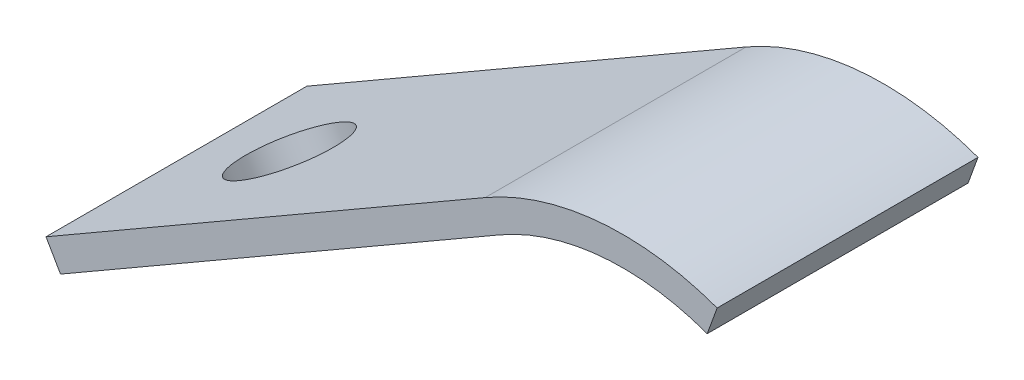
ISO-10303-21;
HEADER;
FILE_DESCRIPTION(('STEP AP214'),'2;1');
FILE_NAME('part.step','',(''),(''),'','','');
FILE_SCHEMA(('AUTOMOTIVE_DESIGN { 1 0 10303 214 1 1 1 1 }'));
ENDSEC;
DATA;
#1=APPLICATION_CONTEXT('core data for automotive mechanical design processes');
#2=APPLICATION_PROTOCOL_DEFINITION('international standard','automotive_design',2000,#1);
#3=PRODUCT_CONTEXT('',#1,'mechanical');
#4=PRODUCT('Part','Part','',(#3));
#5=PRODUCT_RELATED_PRODUCT_CATEGORY('part','',(#4));
#6=PRODUCT_DEFINITION_FORMATION('','',#4);
#7=PRODUCT_DEFINITION_CONTEXT('part definition',#1,'design');
#8=PRODUCT_DEFINITION('design','',#6,#7);
#9=PRODUCT_DEFINITION_SHAPE('','',#8);
#10=(LENGTH_UNIT() NAMED_UNIT(*) SI_UNIT(.MILLI.,.METRE.));
#11=(NAMED_UNIT(*) PLANE_ANGLE_UNIT() SI_UNIT($,.RADIAN.));
#12=(NAMED_UNIT(*) SI_UNIT($,.STERADIAN.) SOLID_ANGLE_UNIT());
#13=UNCERTAINTY_MEASURE_WITH_UNIT(LENGTH_MEASURE(1.E-05),#10,'distance_accuracy_value','');
#14=(GEOMETRIC_REPRESENTATION_CONTEXT(3) GLOBAL_UNCERTAINTY_ASSIGNED_CONTEXT((#13)) GLOBAL_UNIT_ASSIGNED_CONTEXT((#10,
#11,#12)) REPRESENTATION_CONTEXT('',''));
#15=CARTESIAN_POINT('',(0.,0.,0.));
#16=DIRECTION('',(0.,0.,1.));
#17=DIRECTION('',(1.,0.,0.));
#18=AXIS2_PLACEMENT_3D('',#15,#16,#17);
#19=CARTESIAN_POINT('',(-39.8108891324554,-1.04551732809558,9.));
#20=DIRECTION('',(0.86602540378444,0.499999999999998,0.));
#21=DIRECTION('',(-0.499999999999998,0.86602540378444,0.));
#22=AXIS2_PLACEMENT_3D('',#19,#20,#21);
#23=PLANE('',#22);
#24=DIRECTION('',(0.499999999999998,-0.86602540378444,0.));
#25=VECTOR('',#24,1.);
#26=CARTESIAN_POINT('',(-39.8108891324554,-1.04551732809558,-9.));
#27=LINE('',#26,#25);
#28=CARTESIAN_POINT('',(-39.8108891324554,-1.04551732809558,-9.));
#29=VERTEX_POINT('',#28);
#30=CARTESIAN_POINT('',(-38.8108891324554,-2.77756813566445,-9.));
#31=VERTEX_POINT('',#30);
#32=EDGE_CURVE('E119',#29,#31,#27,.T.);
#33=ORIENTED_EDGE('',*,*,#32,.T.);
#34=DIRECTION('',(0.,0.,-1.));
#35=VECTOR('',#34,1.);
#36=CARTESIAN_POINT('',(-38.8108891324554,-2.77756813566445,9.));
#37=LINE('',#36,#35);
#38=CARTESIAN_POINT('',(-38.8108891324554,-2.77756813566445,9.));
#39=VERTEX_POINT('',#38);
#40=EDGE_CURVE('E11',#39,#31,#37,.T.);
#41=ORIENTED_EDGE('',*,*,#40,.F.);
#42=DIRECTION('',(0.499999999999998,-0.86602540378444,0.));
#43=VECTOR('',#42,1.);
#44=CARTESIAN_POINT('',(-39.8108891324554,-1.04551732809558,9.));
#45=LINE('',#44,#43);
#46=CARTESIAN_POINT('',(-39.8108891324554,-1.04551732809558,9.));
#47=VERTEX_POINT('',#46);
#48=EDGE_CURVE('E130',#47,#39,#45,.T.);
#49=ORIENTED_EDGE('',*,*,#48,.F.);
#50=DIRECTION('',(0.,0.,-1.));
#51=VECTOR('',#50,1.);
#52=CARTESIAN_POINT('',(-39.8108891324554,-1.04551732809558,9.));
#53=LINE('',#52,#51);
#54=EDGE_CURVE('E115',#47,#29,#53,.T.);
#55=ORIENTED_EDGE('',*,*,#54,.T.);
#56=EDGE_LOOP('',(#33,#41,#49,#55));
#57=FACE_BOUND('',#56,.T.);
#58=ADVANCED_FACE('F35',(#57),#23,.F.);
#59=CARTESIAN_POINT('',(-38.8108891324554,-2.77756813566445,9.));
#60=DIRECTION('',(-0.499999999999998,0.86602540378444,0.));
#61=DIRECTION('',(-0.86602540378444,-0.499999999999998,0.));
#62=AXIS2_PLACEMENT_3D('',#59,#60,#61);
#63=PLANE('',#62);
#64=CARTESIAN_POINT('',(-31.0166604983954,1.72243186433553,0.));
#65=DIRECTION('',(-0.499999999999998,0.86602540378444,0.));
#66=DIRECTION('',(-0.86602540378444,-0.499999999999998,0.));
#67=AXIS2_PLACEMENT_3D('',#64,#65,#66);
#68=CIRCLE('',#67,3.5);
#69=CARTESIAN_POINT('',(-34.0477494116409,-0.027568135664461,0.));
#70=VERTEX_POINT('',#69);
#71=EDGE_CURVE('E123',#70,#70,#68,.T.);
#72=ORIENTED_EDGE('',*,*,#71,.T.);
#73=EDGE_LOOP('',(#72));
#74=FACE_BOUND('',#73,.T.);
#75=DIRECTION('',(0.86602540378444,0.499999999999998,0.));
#76=VECTOR('',#75,1.);
#77=CARTESIAN_POINT('',(-38.8108891324554,-2.77756813566445,-9.));
#78=LINE('',#77,#76);
#79=CARTESIAN_POINT('',(-8.49999999999996,14.7224318643355,-9.));
#80=VERTEX_POINT('',#79);
#81=EDGE_CURVE('E122',#31,#80,#78,.T.);
#82=ORIENTED_EDGE('',*,*,#81,.T.);
#83=DIRECTION('',(0.,0.,-1.));
#84=VECTOR('',#83,1.);
#85=CARTESIAN_POINT('',(-8.49999999999996,14.7224318643355,9.));
#86=LINE('',#85,#84);
#87=CARTESIAN_POINT('',(-8.49999999999996,14.7224318643355,9.));
#88=VERTEX_POINT('',#87);
#89=EDGE_CURVE('E43',#88,#80,#86,.T.);
#90=ORIENTED_EDGE('',*,*,#89,.F.);
#91=DIRECTION('',(0.86602540378444,0.499999999999998,0.));
#92=VECTOR('',#91,1.);
#93=CARTESIAN_POINT('',(-38.8108891324554,-2.77756813566445,9.));
#94=LINE('',#93,#92);
#95=EDGE_CURVE('E88',#39,#88,#94,.T.);
#96=ORIENTED_EDGE('',*,*,#95,.F.);
#97=ORIENTED_EDGE('',*,*,#40,.T.);
#98=EDGE_LOOP('',(#82,#90,#96,#97));
#99=FACE_BOUND('',#98,.T.);
#100=ADVANCED_FACE('F156',(#74,#99),#63,.F.);
#101=CARTESIAN_POINT('',(0.,0.,9.));
#102=DIRECTION('',(0.,0.,-1.));
#103=DIRECTION('',(-1.,0.,0.));
#104=AXIS2_PLACEMENT_3D('',#101,#102,#103);
#105=CYLINDRICAL_SURFACE('',#104,17.);
#106=CARTESIAN_POINT('',(0.,0.,-9.));
#107=DIRECTION('',(0.,0.,-1.));
#108=DIRECTION('',(1.,0.,0.));
#109=AXIS2_PLACEMENT_3D('',#106,#107,#108);
#110=CIRCLE('',#109,17.);
#111=CARTESIAN_POINT('',(5.81434243653638,15.9747745533604,-9.));
#112=VERTEX_POINT('',#111);
#113=EDGE_CURVE('E125',#80,#112,#110,.T.);
#114=ORIENTED_EDGE('',*,*,#113,.T.);
#115=DIRECTION('',(0.,0.,-1.));
#116=VECTOR('',#115,1.);
#117=CARTESIAN_POINT('',(5.81434243653638,15.9747745533604,9.));
#118=LINE('',#117,#116);
#119=CARTESIAN_POINT('',(5.81434243653638,15.9747745533604,9.));
#120=VERTEX_POINT('',#119);
#121=EDGE_CURVE('E110',#120,#112,#118,.T.);
#122=ORIENTED_EDGE('',*,*,#121,.F.);
#123=CARTESIAN_POINT('',(0.,0.,9.));
#124=DIRECTION('',(0.,0.,-1.));
#125=DIRECTION('',(1.,0.,0.));
#126=AXIS2_PLACEMENT_3D('',#123,#124,#125);
#127=CIRCLE('',#126,17.);
#128=EDGE_CURVE('E101',#88,#120,#127,.T.);
#129=ORIENTED_EDGE('',*,*,#128,.F.);
#130=ORIENTED_EDGE('',*,*,#89,.T.);
#131=EDGE_LOOP('',(#114,#122,#129,#130));
#132=FACE_BOUND('',#131,.T.);
#133=ADVANCED_FACE('F136',(#132),#105,.F.);
#134=CARTESIAN_POINT('',(6.49838272318772,17.8541597949323,9.));
#135=DIRECTION('',(-0.939692620785908,0.342020143325669,0.));
#136=DIRECTION('',(-0.342020143325669,-0.939692620785908,0.));
#137=AXIS2_PLACEMENT_3D('',#134,#135,#136);
#138=PLANE('',#137);
#139=DIRECTION('',(0.342020143325669,0.939692620785908,0.));
#140=VECTOR('',#139,1.);
#141=CARTESIAN_POINT('',(6.49838272318772,17.8541597949323,-9.));
#142=LINE('',#141,#140);
#143=CARTESIAN_POINT('',(6.49838272318772,17.8541597949323,-9.));
#144=VERTEX_POINT('',#143);
#145=EDGE_CURVE('E109',#112,#144,#142,.T.);
#146=ORIENTED_EDGE('',*,*,#145,.T.);
#147=DIRECTION('',(0.,0.,-1.));
#148=VECTOR('',#147,1.);
#149=CARTESIAN_POINT('',(6.49838272318772,17.8541597949323,9.));
#150=LINE('',#149,#148);
#151=CARTESIAN_POINT('',(6.49838272318772,17.8541597949323,9.));
#152=VERTEX_POINT('',#151);
#153=EDGE_CURVE('E106',#152,#144,#150,.T.);
#154=ORIENTED_EDGE('',*,*,#153,.F.);
#155=DIRECTION('',(0.342020143325669,0.939692620785908,0.));
#156=VECTOR('',#155,1.);
#157=CARTESIAN_POINT('',(6.49838272318772,17.8541597949323,9.));
#158=LINE('',#157,#156);
#159=EDGE_CURVE('E95',#120,#152,#158,.T.);
#160=ORIENTED_EDGE('',*,*,#159,.F.);
#161=ORIENTED_EDGE('',*,*,#121,.T.);
#162=EDGE_LOOP('',(#146,#154,#160,#161));
#163=FACE_BOUND('',#162,.T.);
#164=ADVANCED_FACE('F107',(#163),#138,.F.);
#165=CARTESIAN_POINT('',(0.,0.,9.));
#166=DIRECTION('',(0.,0.,-1.));
#167=DIRECTION('',(-1.,0.,0.));
#168=AXIS2_PLACEMENT_3D('',#165,#166,#167);
#169=CYLINDRICAL_SURFACE('',#168,19.);
#170=CARTESIAN_POINT('',(0.,0.,-9.));
#171=DIRECTION('',(0.,0.,1.));
#172=DIRECTION('',(1.,0.,0.));
#173=AXIS2_PLACEMENT_3D('',#170,#171,#172);
#174=CIRCLE('',#173,19.);
#175=CARTESIAN_POINT('',(-9.49999999999995,16.4544826719044,-9.));
#176=VERTEX_POINT('',#175);
#177=EDGE_CURVE('E74',#144,#176,#174,.T.);
#178=ORIENTED_EDGE('',*,*,#177,.T.);
#179=DIRECTION('',(0.,0.,-1.));
#180=VECTOR('',#179,1.);
#181=CARTESIAN_POINT('',(-9.49999999999995,16.4544826719044,9.));
#182=LINE('',#181,#180);
#183=CARTESIAN_POINT('',(-9.49999999999995,16.4544826719044,9.));
#184=VERTEX_POINT('',#183);
#185=EDGE_CURVE('E111',#184,#176,#182,.T.);
#186=ORIENTED_EDGE('',*,*,#185,.F.);
#187=CARTESIAN_POINT('',(0.,0.,9.));
#188=DIRECTION('',(0.,0.,1.));
#189=DIRECTION('',(1.,0.,0.));
#190=AXIS2_PLACEMENT_3D('',#187,#188,#189);
#191=CIRCLE('',#190,19.);
#192=EDGE_CURVE('E99',#152,#184,#191,.T.);
#193=ORIENTED_EDGE('',*,*,#192,.F.);
#194=ORIENTED_EDGE('',*,*,#153,.T.);
#195=EDGE_LOOP('',(#178,#186,#193,#194));
#196=FACE_BOUND('',#195,.T.);
#197=ADVANCED_FACE('F113',(#196),#169,.T.);
#198=CARTESIAN_POINT('',(-39.8108891324554,-1.04551732809558,9.));
#199=DIRECTION('',(0.499999999999998,-0.86602540378444,0.));
#200=DIRECTION('',(0.86602540378444,0.499999999999998,0.));
#201=AXIS2_PLACEMENT_3D('',#198,#199,#200);
#202=PLANE('',#201);
#203=CARTESIAN_POINT('',(-32.0166604983954,3.45448267190441,0.));
#204=DIRECTION('',(-0.499999999999998,0.86602540378444,0.));
#205=DIRECTION('',(-0.86602540378444,-0.499999999999998,0.));
#206=AXIS2_PLACEMENT_3D('',#203,#204,#205);
#207=CIRCLE('',#206,3.5);
#208=CARTESIAN_POINT('',(-35.0477494116409,1.70448267190442,0.));
#209=VERTEX_POINT('',#208);
#210=EDGE_CURVE('E215',#209,#209,#207,.T.);
#211=ORIENTED_EDGE('',*,*,#210,.F.);
#212=EDGE_LOOP('',(#211));
#213=FACE_BOUND('',#212,.T.);
#214=DIRECTION('',(-0.86602540378444,-0.499999999999998,0.));
#215=VECTOR('',#214,1.);
#216=CARTESIAN_POINT('',(-39.8108891324554,-1.04551732809558,-9.));
#217=LINE('',#216,#215);
#218=EDGE_CURVE('E80',#176,#29,#217,.T.);
#219=ORIENTED_EDGE('',*,*,#218,.T.);
#220=ORIENTED_EDGE('',*,*,#54,.F.);
#221=DIRECTION('',(-0.86602540378444,-0.499999999999998,0.));
#222=VECTOR('',#221,1.);
#223=CARTESIAN_POINT('',(-39.8108891324554,-1.04551732809558,9.));
#224=LINE('',#223,#222);
#225=EDGE_CURVE('E51',#184,#47,#224,.T.);
#226=ORIENTED_EDGE('',*,*,#225,.F.);
#227=ORIENTED_EDGE('',*,*,#185,.T.);
#228=EDGE_LOOP('',(#219,#220,#226,#227));
#229=FACE_BOUND('',#228,.T.);
#230=ADVANCED_FACE('F143',(#213,#229),#202,.F.);
#231=CARTESIAN_POINT('',(0.,0.,9.));
#232=DIRECTION('',(0.,0.,1.));
#233=DIRECTION('',(1.,0.,0.));
#234=AXIS2_PLACEMENT_3D('',#231,#232,#233);
#235=PLANE('',#234);
#236=ORIENTED_EDGE('',*,*,#48,.T.);
#237=ORIENTED_EDGE('',*,*,#95,.T.);
#238=ORIENTED_EDGE('',*,*,#128,.T.);
#239=ORIENTED_EDGE('',*,*,#159,.T.);
#240=ORIENTED_EDGE('',*,*,#192,.T.);
#241=ORIENTED_EDGE('',*,*,#225,.T.);
#242=EDGE_LOOP('',(#236,#237,#238,#239,#240,#241));
#243=FACE_BOUND('',#242,.T.);
#244=ADVANCED_FACE('F97',(#243),#235,.T.);
#245=CARTESIAN_POINT('',(0.,0.,-9.));
#246=DIRECTION('',(0.,0.,1.));
#247=DIRECTION('',(1.,0.,0.));
#248=AXIS2_PLACEMENT_3D('',#245,#246,#247);
#249=PLANE('',#248);
#250=ORIENTED_EDGE('',*,*,#32,.F.);
#251=ORIENTED_EDGE('',*,*,#218,.F.);
#252=ORIENTED_EDGE('',*,*,#177,.F.);
#253=ORIENTED_EDGE('',*,*,#145,.F.);
#254=ORIENTED_EDGE('',*,*,#113,.F.);
#255=ORIENTED_EDGE('',*,*,#81,.F.);
#256=EDGE_LOOP('',(#250,#251,#252,#253,#254,#255));
#257=FACE_BOUND('',#256,.T.);
#258=ADVANCED_FACE('F139',(#257),#249,.F.);
#259=CARTESIAN_POINT('',(-23.0166604983954,-12.1339745962155,0.));
#260=DIRECTION('',(-0.499999999999998,0.86602540378444,0.));
#261=DIRECTION('',(-0.86602540378444,-0.499999999999998,0.));
#262=AXIS2_PLACEMENT_3D('',#259,#260,#261);
#263=CYLINDRICAL_SURFACE('',#262,3.5);
#264=ORIENTED_EDGE('',*,*,#210,.T.);
#265=EDGE_LOOP('',(#264));
#266=FACE_BOUND('',#265,.T.);
#267=ORIENTED_EDGE('',*,*,#71,.F.);
#268=EDGE_LOOP('',(#267));
#269=FACE_BOUND('',#268,.T.);
#270=ADVANCED_FACE('F191',(#266,#269),#263,.F.);
#271=CLOSED_SHELL('',(#58,#100,#133,#164,#197,#230,#244,#258,#270));
#272=MANIFOLD_SOLID_BREP('B2',#271);
#273=ADVANCED_BREP_SHAPE_REPRESENTATION('',(#18,#272),#14);
#274=SHAPE_DEFINITION_REPRESENTATION(#9,#273);
ENDSEC;
END-ISO-10303-21;
